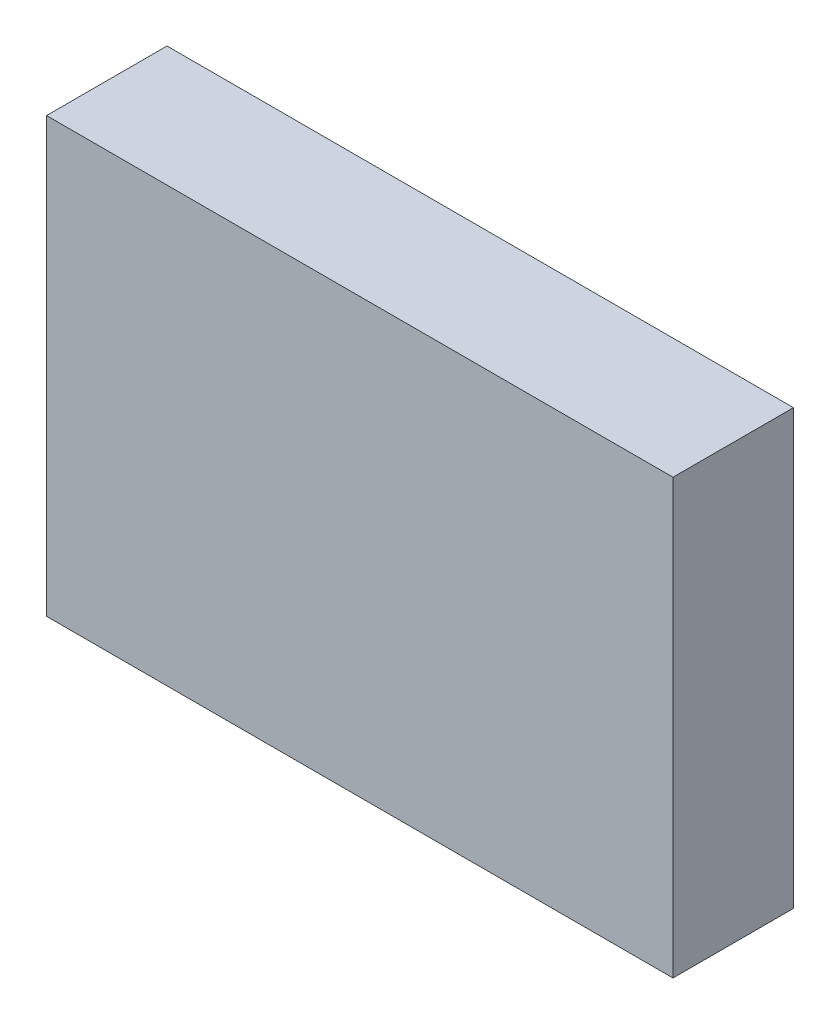
ISO-10303-21;
HEADER;
FILE_DESCRIPTION(('STEP AP214'),'2;1');
FILE_NAME('part.step','',(''),(''),'','','');
FILE_SCHEMA(('AUTOMOTIVE_DESIGN { 1 0 10303 214 1 1 1 1 }'));
ENDSEC;
DATA;
#1=APPLICATION_CONTEXT('core data for automotive mechanical design processes');
#2=APPLICATION_PROTOCOL_DEFINITION('international standard','automotive_design',2000,#1);
#3=PRODUCT_CONTEXT('',#1,'mechanical');
#4=PRODUCT('Part','Part','',(#3));
#5=PRODUCT_RELATED_PRODUCT_CATEGORY('part','',(#4));
#6=PRODUCT_DEFINITION_FORMATION('','',#4);
#7=PRODUCT_DEFINITION_CONTEXT('part definition',#1,'design');
#8=PRODUCT_DEFINITION('design','',#6,#7);
#9=PRODUCT_DEFINITION_SHAPE('','',#8);
#10=(LENGTH_UNIT() NAMED_UNIT(*) SI_UNIT(.MILLI.,.METRE.));
#11=(NAMED_UNIT(*) PLANE_ANGLE_UNIT() SI_UNIT($,.RADIAN.));
#12=(NAMED_UNIT(*) SI_UNIT($,.STERADIAN.) SOLID_ANGLE_UNIT());
#13=UNCERTAINTY_MEASURE_WITH_UNIT(LENGTH_MEASURE(1.E-05),#10,'distance_accuracy_value','');
#14=(GEOMETRIC_REPRESENTATION_CONTEXT(3) GLOBAL_UNCERTAINTY_ASSIGNED_CONTEXT((#13)) GLOBAL_UNIT_ASSIGNED_CONTEXT((#10,
#11,#12)) REPRESENTATION_CONTEXT('',''));
#15=CARTESIAN_POINT('',(0.,0.,0.));
#16=DIRECTION('',(0.,0.,1.));
#17=DIRECTION('',(1.,0.,0.));
#18=AXIS2_PLACEMENT_3D('',#15,#16,#17);
#19=CARTESIAN_POINT('',(13.,9.,5.));
#20=DIRECTION('',(-1.,0.,0.));
#21=DIRECTION('',(0.,-1.,0.));
#22=AXIS2_PLACEMENT_3D('',#19,#20,#21);
#23=PLANE('',#22);
#24=DIRECTION('',(0.,1.,0.));
#25=VECTOR('',#24,1.);
#26=CARTESIAN_POINT('',(13.,9.,0.));
#27=LINE('',#26,#25);
#28=CARTESIAN_POINT('',(13.,-9.,0.));
#29=VERTEX_POINT('',#28);
#30=CARTESIAN_POINT('',(13.,9.,0.));
#31=VERTEX_POINT('',#30);
#32=EDGE_CURVE('E96',#29,#31,#27,.T.);
#33=ORIENTED_EDGE('',*,*,#32,.T.);
#34=DIRECTION('',(0.,0.,-1.));
#35=VECTOR('',#34,1.);
#36=CARTESIAN_POINT('',(13.,9.,5.));
#37=LINE('',#36,#35);
#38=CARTESIAN_POINT('',(13.,9.,5.));
#39=VERTEX_POINT('',#38);
#40=EDGE_CURVE('E11',#39,#31,#37,.T.);
#41=ORIENTED_EDGE('',*,*,#40,.F.);
#42=DIRECTION('',(0.,1.,0.));
#43=VECTOR('',#42,1.);
#44=CARTESIAN_POINT('',(13.,9.,5.));
#45=LINE('',#44,#43);
#46=CARTESIAN_POINT('',(13.,-9.,5.));
#47=VERTEX_POINT('',#46);
#48=EDGE_CURVE('E84',#47,#39,#45,.T.);
#49=ORIENTED_EDGE('',*,*,#48,.F.);
#50=DIRECTION('',(0.,0.,-1.));
#51=VECTOR('',#50,1.);
#52=CARTESIAN_POINT('',(13.,-9.,5.));
#53=LINE('',#52,#51);
#54=EDGE_CURVE('E92',#47,#29,#53,.T.);
#55=ORIENTED_EDGE('',*,*,#54,.T.);
#56=EDGE_LOOP('',(#33,#41,#49,#55));
#57=FACE_BOUND('',#56,.T.);
#58=ADVANCED_FACE('F33',(#57),#23,.F.);
#59=CARTESIAN_POINT('',(-13.,9.,5.));
#60=DIRECTION('',(0.,-1.,0.));
#61=DIRECTION('',(0.,0.,-1.));
#62=AXIS2_PLACEMENT_3D('',#59,#60,#61);
#63=PLANE('',#62);
#64=DIRECTION('',(-1.,0.,0.));
#65=VECTOR('',#64,1.);
#66=CARTESIAN_POINT('',(-13.,9.,0.));
#67=LINE('',#66,#65);
#68=CARTESIAN_POINT('',(-13.,9.,0.));
#69=VERTEX_POINT('',#68);
#70=EDGE_CURVE('E88',#31,#69,#67,.T.);
#71=ORIENTED_EDGE('',*,*,#70,.T.);
#72=DIRECTION('',(0.,0.,-1.));
#73=VECTOR('',#72,1.);
#74=CARTESIAN_POINT('',(-13.,9.,5.));
#75=LINE('',#74,#73);
#76=CARTESIAN_POINT('',(-13.,9.,5.));
#77=VERTEX_POINT('',#76);
#78=EDGE_CURVE('E41',#77,#69,#75,.T.);
#79=ORIENTED_EDGE('',*,*,#78,.F.);
#80=DIRECTION('',(-1.,0.,0.));
#81=VECTOR('',#80,1.);
#82=CARTESIAN_POINT('',(-13.,9.,5.));
#83=LINE('',#82,#81);
#84=EDGE_CURVE('E79',#39,#77,#83,.T.);
#85=ORIENTED_EDGE('',*,*,#84,.F.);
#86=ORIENTED_EDGE('',*,*,#40,.T.);
#87=EDGE_LOOP('',(#71,#79,#85,#86));
#88=FACE_BOUND('',#87,.T.);
#89=ADVANCED_FACE('F87',(#88),#63,.F.);
#90=CARTESIAN_POINT('',(-13.,9.,5.));
#91=DIRECTION('',(1.,0.,0.));
#92=DIRECTION('',(0.,1.,0.));
#93=AXIS2_PLACEMENT_3D('',#90,#91,#92);
#94=PLANE('',#93);
#95=DIRECTION('',(0.,-1.,0.));
#96=VECTOR('',#95,1.);
#97=CARTESIAN_POINT('',(-13.,9.,0.));
#98=LINE('',#97,#96);
#99=CARTESIAN_POINT('',(-13.,-9.,0.));
#100=VERTEX_POINT('',#99);
#101=EDGE_CURVE('E66',#69,#100,#98,.T.);
#102=ORIENTED_EDGE('',*,*,#101,.T.);
#103=DIRECTION('',(0.,0.,-1.));
#104=VECTOR('',#103,1.);
#105=CARTESIAN_POINT('',(-13.,-9.,5.));
#106=LINE('',#105,#104);
#107=CARTESIAN_POINT('',(-13.,-9.,5.));
#108=VERTEX_POINT('',#107);
#109=EDGE_CURVE('E89',#108,#100,#106,.T.);
#110=ORIENTED_EDGE('',*,*,#109,.F.);
#111=DIRECTION('',(0.,-1.,0.));
#112=VECTOR('',#111,1.);
#113=CARTESIAN_POINT('',(-13.,9.,5.));
#114=LINE('',#113,#112);
#115=EDGE_CURVE('E82',#77,#108,#114,.T.);
#116=ORIENTED_EDGE('',*,*,#115,.F.);
#117=ORIENTED_EDGE('',*,*,#78,.T.);
#118=EDGE_LOOP('',(#102,#110,#116,#117));
#119=FACE_BOUND('',#118,.T.);
#120=ADVANCED_FACE('F90',(#119),#94,.F.);
#121=CARTESIAN_POINT('',(-13.,-9.,5.));
#122=DIRECTION('',(0.,1.,0.));
#123=DIRECTION('',(0.,0.,1.));
#124=AXIS2_PLACEMENT_3D('',#121,#122,#123);
#125=PLANE('',#124);
#126=DIRECTION('',(1.,0.,0.));
#127=VECTOR('',#126,1.);
#128=CARTESIAN_POINT('',(-13.,-9.,0.));
#129=LINE('',#128,#127);
#130=EDGE_CURVE('E72',#100,#29,#129,.T.);
#131=ORIENTED_EDGE('',*,*,#130,.T.);
#132=ORIENTED_EDGE('',*,*,#54,.F.);
#133=DIRECTION('',(1.,0.,0.));
#134=VECTOR('',#133,1.);
#135=CARTESIAN_POINT('',(-13.,-9.,5.));
#136=LINE('',#135,#134);
#137=EDGE_CURVE('E49',#108,#47,#136,.T.);
#138=ORIENTED_EDGE('',*,*,#137,.F.);
#139=ORIENTED_EDGE('',*,*,#109,.T.);
#140=EDGE_LOOP('',(#131,#132,#138,#139));
#141=FACE_BOUND('',#140,.T.);
#142=ADVANCED_FACE('F103',(#141),#125,.F.);
#143=CARTESIAN_POINT('',(0.,0.,5.));
#144=DIRECTION('',(0.,0.,1.));
#145=DIRECTION('',(1.,0.,0.));
#146=AXIS2_PLACEMENT_3D('',#143,#144,#145);
#147=PLANE('',#146);
#148=ORIENTED_EDGE('',*,*,#48,.T.);
#149=ORIENTED_EDGE('',*,*,#84,.T.);
#150=ORIENTED_EDGE('',*,*,#115,.T.);
#151=ORIENTED_EDGE('',*,*,#137,.T.);
#152=EDGE_LOOP('',(#148,#149,#150,#151));
#153=FACE_BOUND('',#152,.T.);
#154=ADVANCED_FACE('F80',(#153),#147,.T.);
#155=CARTESIAN_POINT('',(0.,0.,0.));
#156=DIRECTION('',(0.,0.,1.));
#157=DIRECTION('',(1.,0.,0.));
#158=AXIS2_PLACEMENT_3D('',#155,#156,#157);
#159=PLANE('',#158);
#160=ORIENTED_EDGE('',*,*,#32,.F.);
#161=ORIENTED_EDGE('',*,*,#130,.F.);
#162=ORIENTED_EDGE('',*,*,#101,.F.);
#163=ORIENTED_EDGE('',*,*,#70,.F.);
#164=EDGE_LOOP('',(#160,#161,#162,#163));
#165=FACE_BOUND('',#164,.T.);
#166=ADVANCED_FACE('F106',(#165),#159,.F.);
#167=CLOSED_SHELL('',(#58,#89,#120,#142,#154,#166));
#168=MANIFOLD_SOLID_BREP('B2',#167);
#169=ADVANCED_BREP_SHAPE_REPRESENTATION('',(#18,#168),#14);
#170=SHAPE_DEFINITION_REPRESENTATION(#9,#169);
ENDSEC;
END-ISO-10303-21;
